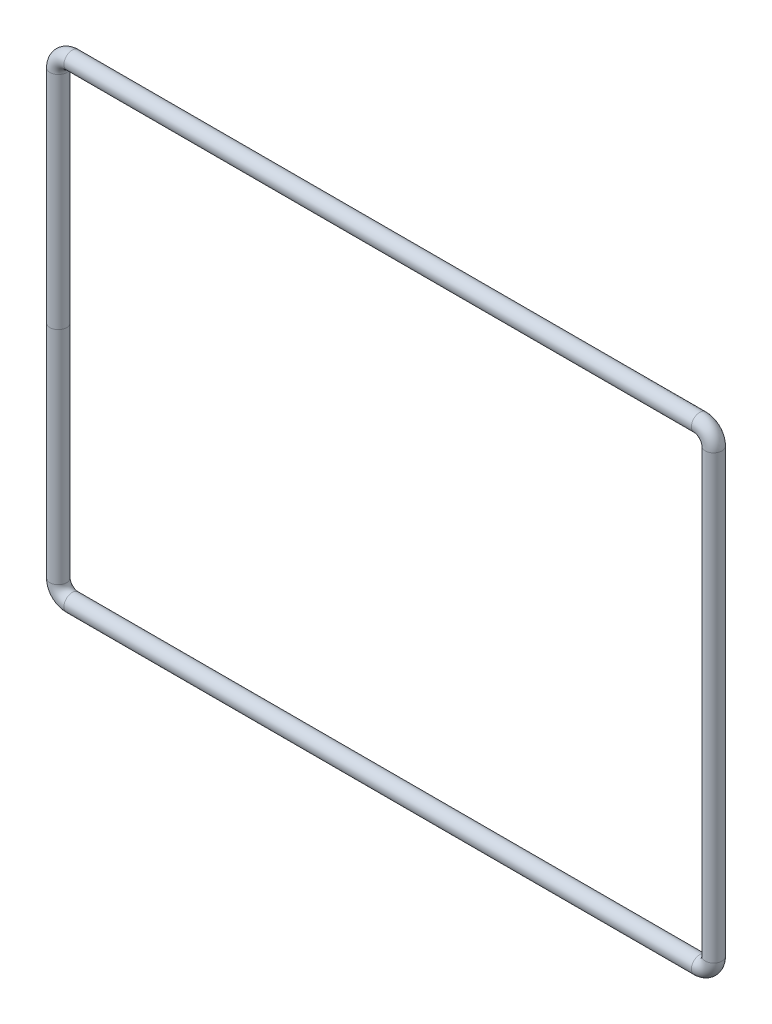
ISO-10303-21;
HEADER;
FILE_DESCRIPTION(('STEP AP214'),'2;1');
FILE_NAME('part.step','',(''),(''),'','','');
FILE_SCHEMA(('AUTOMOTIVE_DESIGN { 1 0 10303 214 1 1 1 1 }'));
ENDSEC;
DATA;
#1=APPLICATION_CONTEXT('core data for automotive mechanical design processes');
#2=APPLICATION_PROTOCOL_DEFINITION('international standard','automotive_design',2000,#1);
#3=PRODUCT_CONTEXT('',#1,'mechanical');
#4=PRODUCT('Part','Part','',(#3));
#5=PRODUCT_RELATED_PRODUCT_CATEGORY('part','',(#4));
#6=PRODUCT_DEFINITION_FORMATION('','',#4);
#7=PRODUCT_DEFINITION_CONTEXT('part definition',#1,'design');
#8=PRODUCT_DEFINITION('design','',#6,#7);
#9=PRODUCT_DEFINITION_SHAPE('','',#8);
#10=(LENGTH_UNIT() NAMED_UNIT(*) SI_UNIT(.MILLI.,.METRE.));
#11=(NAMED_UNIT(*) PLANE_ANGLE_UNIT() SI_UNIT($,.RADIAN.));
#12=(NAMED_UNIT(*) SI_UNIT($,.STERADIAN.) SOLID_ANGLE_UNIT());
#13=UNCERTAINTY_MEASURE_WITH_UNIT(LENGTH_MEASURE(1.E-05),#10,'distance_accuracy_value','');
#14=(GEOMETRIC_REPRESENTATION_CONTEXT(3) GLOBAL_UNCERTAINTY_ASSIGNED_CONTEXT((#13)) GLOBAL_UNIT_ASSIGNED_CONTEXT((#10,
#11,#12)) REPRESENTATION_CONTEXT('',''));
#15=CARTESIAN_POINT('',(0.,0.,0.));
#16=DIRECTION('',(0.,0.,1.));
#17=DIRECTION('',(1.,0.,0.));
#18=AXIS2_PLACEMENT_3D('',#15,#16,#17);
#19=CARTESIAN_POINT('',(-35.3,0.,0.));
#20=DIRECTION('',(0.,1.,0.));
#21=DIRECTION('',(-1.,0.,0.));
#22=AXIS2_PLACEMENT_3D('',#19,#20,#21);
#23=CYLINDRICAL_SURFACE('',#22,0.899999999999997);
#24=CARTESIAN_POINT('',(-35.3,23.8,0.));
#25=DIRECTION('',(0.,-1.,0.));
#26=DIRECTION('',(1.,0.,0.));
#27=AXIS2_PLACEMENT_3D('',#24,#25,#26);
#28=CIRCLE('',#27,0.899999999999997);
#29=CARTESIAN_POINT('',(-36.2,23.8,0.));
#30=VERTEX_POINT('',#29);
#31=EDGE_CURVE('E60',#30,#30,#28,.T.);
#32=ORIENTED_EDGE('',*,*,#31,.T.);
#33=EDGE_LOOP('',(#32));
#34=FACE_BOUND('',#33,.T.);
#35=CARTESIAN_POINT('',(-35.3,0.,0.));
#36=DIRECTION('',(0.,-1.,0.));
#37=DIRECTION('',(1.,0.,0.));
#38=AXIS2_PLACEMENT_3D('',#35,#36,#37);
#39=CIRCLE('',#38,0.899999999999997);
#40=CARTESIAN_POINT('',(-34.4,0.,0.));
#41=VERTEX_POINT('',#40);
#42=EDGE_CURVE('E63',#41,#41,#39,.T.);
#43=ORIENTED_EDGE('',*,*,#42,.F.);
#44=EDGE_LOOP('',(#43));
#45=FACE_BOUND('',#44,.T.);
#46=ADVANCED_FACE('F31',(#34,#45),#23,.T.);
#47=CARTESIAN_POINT('',(-33.8,23.8,0.));
#48=DIRECTION('',(0.,0.,-1.));
#49=DIRECTION('',(-1.,0.,0.));
#50=AXIS2_PLACEMENT_3D('',#47,#48,#49);
#51=TOROIDAL_SURFACE('',#50,1.50000000000002,0.899999999999997);
#52=CARTESIAN_POINT('',(-33.8,25.3,0.));
#53=DIRECTION('',(-1.,0.,0.));
#54=DIRECTION('',(0.,-1.,0.));
#55=AXIS2_PLACEMENT_3D('',#52,#53,#54);
#56=CIRCLE('',#55,0.899999999999997);
#57=CARTESIAN_POINT('',(-33.8,26.2,0.));
#58=VERTEX_POINT('',#57);
#59=EDGE_CURVE('E57',#58,#58,#56,.T.);
#60=CARTESIAN_POINT('',(-33.8,23.8,0.));
#61=DIRECTION('',(0.,0.,-1.));
#62=DIRECTION('',(-1.,0.,0.));
#63=AXIS2_PLACEMENT_3D('',#60,#61,#62);
#64=CIRCLE('',#63,2.40000000000001);
#65=EDGE_CURVE('',#30,#58,#64,.T.);
#66=ORIENTED_EDGE('',*,*,#31,.F.);
#67=ORIENTED_EDGE('',*,*,#59,.T.);
#68=ORIENTED_EDGE('',*,*,#65,.T.);
#69=ORIENTED_EDGE('',*,*,#65,.F.);
#70=EDGE_LOOP('',(#66,#68,#67,#69));
#71=FACE_BOUND('',#70,.T.);
#72=ADVANCED_FACE('F70',(#71),#51,.T.);
#73=CARTESIAN_POINT('',(-33.8,25.3,0.));
#74=DIRECTION('',(1.,0.,0.));
#75=DIRECTION('',(0.,0.,-1.));
#76=AXIS2_PLACEMENT_3D('',#73,#74,#75);
#77=CYLINDRICAL_SURFACE('',#76,0.899999999999997);
#78=CARTESIAN_POINT('',(33.7999999999999,25.3,0.));
#79=DIRECTION('',(-1.,0.,0.));
#80=DIRECTION('',(0.,-1.,0.));
#81=AXIS2_PLACEMENT_3D('',#78,#79,#80);
#82=CIRCLE('',#81,0.899999999999997);
#83=CARTESIAN_POINT('',(33.7999999999999,26.2,0.));
#84=VERTEX_POINT('',#83);
#85=EDGE_CURVE('E54',#84,#84,#82,.T.);
#86=ORIENTED_EDGE('',*,*,#85,.T.);
#87=EDGE_LOOP('',(#86));
#88=FACE_BOUND('',#87,.T.);
#89=ORIENTED_EDGE('',*,*,#59,.F.);
#90=EDGE_LOOP('',(#89));
#91=FACE_BOUND('',#90,.T.);
#92=ADVANCED_FACE('F76',(#88,#91),#77,.T.);
#93=CARTESIAN_POINT('',(33.8,23.8,0.));
#94=DIRECTION('',(0.,0.,-1.));
#95=DIRECTION('',(-1.,0.,0.));
#96=AXIS2_PLACEMENT_3D('',#93,#94,#95);
#97=TOROIDAL_SURFACE('',#96,1.50000000000002,0.899999999999997);
#98=CARTESIAN_POINT('',(35.3,23.8,0.));
#99=DIRECTION('',(0.,1.,0.));
#100=DIRECTION('',(-1.,0.,0.));
#101=AXIS2_PLACEMENT_3D('',#98,#99,#100);
#102=CIRCLE('',#101,0.899999999999997);
#103=CARTESIAN_POINT('',(36.2,23.8,0.));
#104=VERTEX_POINT('',#103);
#105=EDGE_CURVE('E51',#104,#104,#102,.T.);
#106=CARTESIAN_POINT('',(33.8,23.8,0.));
#107=DIRECTION('',(0.,0.,-1.));
#108=DIRECTION('',(-1.,0.,0.));
#109=AXIS2_PLACEMENT_3D('',#106,#107,#108);
#110=CIRCLE('',#109,2.40000000000001);
#111=EDGE_CURVE('',#84,#104,#110,.T.);
#112=ORIENTED_EDGE('',*,*,#85,.F.);
#113=ORIENTED_EDGE('',*,*,#105,.T.);
#114=ORIENTED_EDGE('',*,*,#111,.T.);
#115=ORIENTED_EDGE('',*,*,#111,.F.);
#116=EDGE_LOOP('',(#112,#114,#113,#115));
#117=FACE_BOUND('',#116,.T.);
#118=ADVANCED_FACE('F82',(#117),#97,.T.);
#119=CARTESIAN_POINT('',(35.3,23.8,0.));
#120=DIRECTION('',(0.,-1.,0.));
#121=DIRECTION('',(1.,0.,0.));
#122=AXIS2_PLACEMENT_3D('',#119,#120,#121);
#123=CYLINDRICAL_SURFACE('',#122,0.899999999999997);
#124=CARTESIAN_POINT('',(35.3,-23.8,0.));
#125=DIRECTION('',(0.,1.,0.));
#126=DIRECTION('',(-1.,0.,0.));
#127=AXIS2_PLACEMENT_3D('',#124,#125,#126);
#128=CIRCLE('',#127,0.899999999999997);
#129=CARTESIAN_POINT('',(36.2,-23.8,0.));
#130=VERTEX_POINT('',#129);
#131=EDGE_CURVE('E46',#130,#130,#128,.T.);
#132=ORIENTED_EDGE('',*,*,#131,.T.);
#133=EDGE_LOOP('',(#132));
#134=FACE_BOUND('',#133,.T.);
#135=ORIENTED_EDGE('',*,*,#105,.F.);
#136=EDGE_LOOP('',(#135));
#137=FACE_BOUND('',#136,.T.);
#138=ADVANCED_FACE('F86',(#134,#137),#123,.T.);
#139=CARTESIAN_POINT('',(33.8,-23.8,0.));
#140=DIRECTION('',(0.,0.,-1.));
#141=DIRECTION('',(-1.,0.,0.));
#142=AXIS2_PLACEMENT_3D('',#139,#140,#141);
#143=TOROIDAL_SURFACE('',#142,1.50000000000002,0.899999999999997);
#144=CARTESIAN_POINT('',(33.8,-25.3,0.));
#145=DIRECTION('',(1.,0.,0.));
#146=DIRECTION('',(0.,1.,0.));
#147=AXIS2_PLACEMENT_3D('',#144,#145,#146);
#148=CIRCLE('',#147,0.899999999999997);
#149=CARTESIAN_POINT('',(33.8,-26.2,0.));
#150=VERTEX_POINT('',#149);
#151=EDGE_CURVE('E42',#150,#150,#148,.T.);
#152=CARTESIAN_POINT('',(33.8,-23.8,0.));
#153=DIRECTION('',(0.,0.,-1.));
#154=DIRECTION('',(-1.,0.,0.));
#155=AXIS2_PLACEMENT_3D('',#152,#153,#154);
#156=CIRCLE('',#155,2.40000000000001);
#157=EDGE_CURVE('',#130,#150,#156,.T.);
#158=ORIENTED_EDGE('',*,*,#131,.F.);
#159=ORIENTED_EDGE('',*,*,#151,.T.);
#160=ORIENTED_EDGE('',*,*,#157,.T.);
#161=ORIENTED_EDGE('',*,*,#157,.F.);
#162=EDGE_LOOP('',(#158,#160,#159,#161));
#163=FACE_BOUND('',#162,.T.);
#164=ADVANCED_FACE('F90',(#163),#143,.T.);
#165=CARTESIAN_POINT('',(33.8,-25.3,0.));
#166=DIRECTION('',(-1.,0.,0.));
#167=DIRECTION('',(0.,0.,1.));
#168=AXIS2_PLACEMENT_3D('',#165,#166,#167);
#169=CYLINDRICAL_SURFACE('',#168,0.899999999999997);
#170=CARTESIAN_POINT('',(-33.8,-25.3,0.));
#171=DIRECTION('',(1.,0.,0.));
#172=DIRECTION('',(0.,1.,0.));
#173=AXIS2_PLACEMENT_3D('',#170,#171,#172);
#174=CIRCLE('',#173,0.899999999999997);
#175=CARTESIAN_POINT('',(-33.8,-26.2,0.));
#176=VERTEX_POINT('',#175);
#177=EDGE_CURVE('E38',#176,#176,#174,.T.);
#178=ORIENTED_EDGE('',*,*,#177,.T.);
#179=EDGE_LOOP('',(#178));
#180=FACE_BOUND('',#179,.T.);
#181=ORIENTED_EDGE('',*,*,#151,.F.);
#182=EDGE_LOOP('',(#181));
#183=FACE_BOUND('',#182,.T.);
#184=ADVANCED_FACE('F94',(#180,#183),#169,.T.);
#185=CARTESIAN_POINT('',(-33.8,-23.8,0.));
#186=DIRECTION('',(0.,0.,-1.));
#187=DIRECTION('',(-1.,0.,0.));
#188=AXIS2_PLACEMENT_3D('',#185,#186,#187);
#189=TOROIDAL_SURFACE('',#188,1.50000000000002,0.899999999999997);
#190=CARTESIAN_POINT('',(-35.3,-23.8000000000002,0.));
#191=DIRECTION('',(0.,-1.,0.));
#192=DIRECTION('',(1.,0.,0.));
#193=AXIS2_PLACEMENT_3D('',#190,#191,#192);
#194=CIRCLE('',#193,0.899999999999997);
#195=CARTESIAN_POINT('',(-36.2,-23.8000000000004,0.));
#196=VERTEX_POINT('',#195);
#197=EDGE_CURVE('E10',#196,#196,#194,.T.);
#198=CARTESIAN_POINT('',(-33.8,-23.8,0.));
#199=DIRECTION('',(0.,0.,-1.));
#200=DIRECTION('',(-1.,0.,0.));
#201=AXIS2_PLACEMENT_3D('',#198,#199,#200);
#202=CIRCLE('',#201,2.40000000000001);
#203=EDGE_CURVE('',#176,#196,#202,.T.);
#204=ORIENTED_EDGE('',*,*,#177,.F.);
#205=ORIENTED_EDGE('',*,*,#197,.T.);
#206=ORIENTED_EDGE('',*,*,#203,.T.);
#207=ORIENTED_EDGE('',*,*,#203,.F.);
#208=EDGE_LOOP('',(#204,#206,#205,#207));
#209=FACE_BOUND('',#208,.T.);
#210=ADVANCED_FACE('F97',(#209),#189,.T.);
#211=CARTESIAN_POINT('',(-35.3,-23.8,0.));
#212=DIRECTION('',(0.,1.,0.));
#213=DIRECTION('',(-1.,0.,0.));
#214=AXIS2_PLACEMENT_3D('',#211,#212,#213);
#215=CYLINDRICAL_SURFACE('',#214,0.899999999999997);
#216=ORIENTED_EDGE('',*,*,#42,.T.);
#217=EDGE_LOOP('',(#216));
#218=FACE_BOUND('',#217,.T.);
#219=ORIENTED_EDGE('',*,*,#197,.F.);
#220=EDGE_LOOP('',(#219));
#221=FACE_BOUND('',#220,.T.);
#222=ADVANCED_FACE('F33',(#218,#221),#215,.T.);
#223=CLOSED_SHELL('',(#46,#72,#92,#118,#138,#164,#184,#210,#222));
#224=MANIFOLD_SOLID_BREP('B2',#223);
#225=ADVANCED_BREP_SHAPE_REPRESENTATION('',(#18,#224),#14);
#226=SHAPE_DEFINITION_REPRESENTATION(#9,#225);
ENDSEC;
END-ISO-10303-21;
